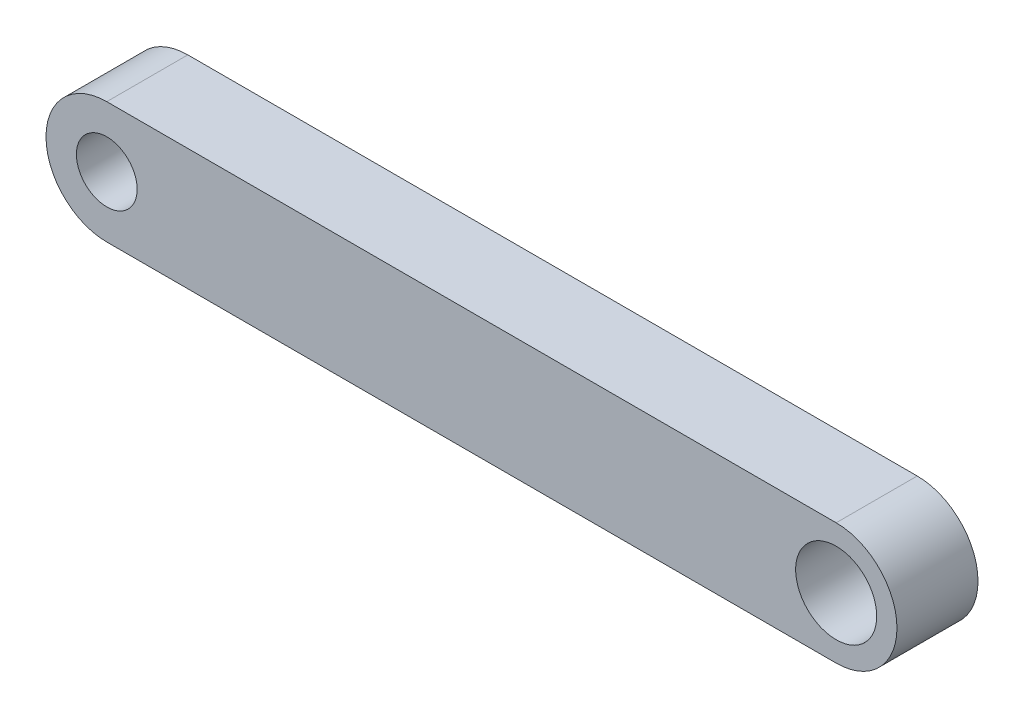
ISO-10303-21;
HEADER;
FILE_DESCRIPTION(('STEP AP214'),'2;1');
FILE_NAME('part.step','',(''),(''),'','','');
FILE_SCHEMA(('AUTOMOTIVE_DESIGN { 1 0 10303 214 1 1 1 1 }'));
ENDSEC;
DATA;
#1=APPLICATION_CONTEXT('core data for automotive mechanical design processes');
#2=APPLICATION_PROTOCOL_DEFINITION('international standard','automotive_design',2000,#1);
#3=PRODUCT_CONTEXT('',#1,'mechanical');
#4=PRODUCT('Part','Part','',(#3));
#5=PRODUCT_RELATED_PRODUCT_CATEGORY('part','',(#4));
#6=PRODUCT_DEFINITION_FORMATION('','',#4);
#7=PRODUCT_DEFINITION_CONTEXT('part definition',#1,'design');
#8=PRODUCT_DEFINITION('design','',#6,#7);
#9=PRODUCT_DEFINITION_SHAPE('','',#8);
#10=(LENGTH_UNIT() NAMED_UNIT(*) SI_UNIT(.MILLI.,.METRE.));
#11=(NAMED_UNIT(*) PLANE_ANGLE_UNIT() SI_UNIT($,.RADIAN.));
#12=(NAMED_UNIT(*) SI_UNIT($,.STERADIAN.) SOLID_ANGLE_UNIT());
#13=UNCERTAINTY_MEASURE_WITH_UNIT(LENGTH_MEASURE(1.E-05),#10,'distance_accuracy_value','');
#14=(GEOMETRIC_REPRESENTATION_CONTEXT(3) GLOBAL_UNCERTAINTY_ASSIGNED_CONTEXT((#13)) GLOBAL_UNIT_ASSIGNED_CONTEXT((#10,
#11,#12)) REPRESENTATION_CONTEXT('',''));
#15=CARTESIAN_POINT('',(0.,0.,0.));
#16=DIRECTION('',(0.,0.,1.));
#17=DIRECTION('',(1.,0.,0.));
#18=AXIS2_PLACEMENT_3D('',#15,#16,#17);
#19=CARTESIAN_POINT('',(-36.,0.,4.));
#20=DIRECTION('',(0.,0.,-1.));
#21=DIRECTION('',(-1.,0.,0.));
#22=AXIS2_PLACEMENT_3D('',#19,#20,#21);
#23=PLANE('',#22);
#24=CARTESIAN_POINT('',(-36.,0.,4.));
#25=DIRECTION('',(0.,0.,1.));
#26=DIRECTION('',(-1.,0.,0.));
#27=AXIS2_PLACEMENT_3D('',#24,#25,#26);
#28=CIRCLE('',#27,3.);
#29=CARTESIAN_POINT('',(-36.,3.,4.));
#30=VERTEX_POINT('',#29);
#31=CARTESIAN_POINT('',(-36.,-3.,4.));
#32=VERTEX_POINT('',#31);
#33=EDGE_CURVE('E95',#30,#32,#28,.T.);
#34=ORIENTED_EDGE('',*,*,#33,.T.);
#35=DIRECTION('',(1.,0.,0.));
#36=VECTOR('',#35,1.);
#37=CARTESIAN_POINT('',(0.,-3.,4.));
#38=LINE('',#37,#36);
#39=CARTESIAN_POINT('',(0.,-3.,4.));
#40=VERTEX_POINT('',#39);
#41=EDGE_CURVE('E90',#32,#40,#38,.T.);
#42=ORIENTED_EDGE('',*,*,#41,.T.);
#43=CARTESIAN_POINT('',(0.,0.,4.));
#44=DIRECTION('',(0.,0.,1.));
#45=DIRECTION('',(1.,0.,0.));
#46=AXIS2_PLACEMENT_3D('',#43,#44,#45);
#47=CIRCLE('',#46,3.);
#48=CARTESIAN_POINT('',(0.,3.,4.));
#49=VERTEX_POINT('',#48);
#50=EDGE_CURVE('E93',#40,#49,#47,.T.);
#51=ORIENTED_EDGE('',*,*,#50,.T.);
#52=DIRECTION('',(-1.,0.,0.));
#53=VECTOR('',#52,1.);
#54=CARTESIAN_POINT('',(0.,3.,4.));
#55=LINE('',#54,#53);
#56=EDGE_CURVE('E60',#49,#30,#55,.T.);
#57=ORIENTED_EDGE('',*,*,#56,.T.);
#58=EDGE_LOOP('',(#34,#42,#51,#57));
#59=FACE_BOUND('',#58,.T.);
#60=CARTESIAN_POINT('',(0.,0.,4.));
#61=DIRECTION('',(0.,0.,1.));
#62=DIRECTION('',(1.,0.,0.));
#63=AXIS2_PLACEMENT_3D('',#60,#61,#62);
#64=CIRCLE('',#63,2.);
#65=CARTESIAN_POINT('',(2.,0.,4.));
#66=VERTEX_POINT('',#65);
#67=EDGE_CURVE('E110',#66,#66,#64,.T.);
#68=ORIENTED_EDGE('',*,*,#67,.F.);
#69=EDGE_LOOP('',(#68));
#70=FACE_BOUND('',#69,.T.);
#71=CARTESIAN_POINT('',(-36.,0.,4.));
#72=DIRECTION('',(0.,0.,1.));
#73=DIRECTION('',(-1.,0.,0.));
#74=AXIS2_PLACEMENT_3D('',#71,#72,#73);
#75=CIRCLE('',#74,1.5);
#76=CARTESIAN_POINT('',(-37.5,0.,4.));
#77=VERTEX_POINT('',#76);
#78=EDGE_CURVE('E125',#77,#77,#75,.T.);
#79=ORIENTED_EDGE('',*,*,#78,.F.);
#80=EDGE_LOOP('',(#79));
#81=FACE_BOUND('',#80,.T.);
#82=ADVANCED_FACE('F43',(#59,#70,#81),#23,.F.);
#83=CARTESIAN_POINT('',(-36.,0.,0.));
#84=DIRECTION('',(0.,0.,-1.));
#85=DIRECTION('',(-1.,0.,0.));
#86=AXIS2_PLACEMENT_3D('',#83,#84,#85);
#87=PLANE('',#86);
#88=CARTESIAN_POINT('',(0.,0.,0.));
#89=DIRECTION('',(0.,0.,1.));
#90=DIRECTION('',(1.,0.,0.));
#91=AXIS2_PLACEMENT_3D('',#88,#89,#90);
#92=CIRCLE('',#91,2.);
#93=CARTESIAN_POINT('',(2.,0.,0.));
#94=VERTEX_POINT('',#93);
#95=EDGE_CURVE('E122',#94,#94,#92,.T.);
#96=ORIENTED_EDGE('',*,*,#95,.T.);
#97=EDGE_LOOP('',(#96));
#98=FACE_BOUND('',#97,.T.);
#99=CARTESIAN_POINT('',(-36.,0.,0.));
#100=DIRECTION('',(0.,0.,1.));
#101=DIRECTION('',(-1.,0.,0.));
#102=AXIS2_PLACEMENT_3D('',#99,#100,#101);
#103=CIRCLE('',#102,3.);
#104=CARTESIAN_POINT('',(-36.,3.,0.));
#105=VERTEX_POINT('',#104);
#106=CARTESIAN_POINT('',(-36.,-3.,0.));
#107=VERTEX_POINT('',#106);
#108=EDGE_CURVE('E107',#105,#107,#103,.T.);
#109=ORIENTED_EDGE('',*,*,#108,.F.);
#110=DIRECTION('',(-1.,0.,0.));
#111=VECTOR('',#110,1.);
#112=CARTESIAN_POINT('',(0.,3.,0.));
#113=LINE('',#112,#111);
#114=CARTESIAN_POINT('',(0.,3.,0.));
#115=VERTEX_POINT('',#114);
#116=EDGE_CURVE('E83',#115,#105,#113,.T.);
#117=ORIENTED_EDGE('',*,*,#116,.F.);
#118=CARTESIAN_POINT('',(0.,0.,0.));
#119=DIRECTION('',(0.,0.,1.));
#120=DIRECTION('',(1.,0.,0.));
#121=AXIS2_PLACEMENT_3D('',#118,#119,#120);
#122=CIRCLE('',#121,3.);
#123=CARTESIAN_POINT('',(0.,-3.,0.));
#124=VERTEX_POINT('',#123);
#125=EDGE_CURVE('E77',#124,#115,#122,.T.);
#126=ORIENTED_EDGE('',*,*,#125,.F.);
#127=DIRECTION('',(1.,0.,0.));
#128=VECTOR('',#127,1.);
#129=CARTESIAN_POINT('',(0.,-3.,0.));
#130=LINE('',#129,#128);
#131=EDGE_CURVE('E99',#107,#124,#130,.T.);
#132=ORIENTED_EDGE('',*,*,#131,.F.);
#133=EDGE_LOOP('',(#109,#117,#126,#132));
#134=FACE_BOUND('',#133,.T.);
#135=CARTESIAN_POINT('',(-36.,0.,0.));
#136=DIRECTION('',(0.,0.,1.));
#137=DIRECTION('',(-1.,0.,0.));
#138=AXIS2_PLACEMENT_3D('',#135,#136,#137);
#139=CIRCLE('',#138,1.5);
#140=CARTESIAN_POINT('',(-37.5,0.,0.));
#141=VERTEX_POINT('',#140);
#142=EDGE_CURVE('E128',#141,#141,#139,.T.);
#143=ORIENTED_EDGE('',*,*,#142,.T.);
#144=EDGE_LOOP('',(#143));
#145=FACE_BOUND('',#144,.T.);
#146=ADVANCED_FACE('F118',(#98,#134,#145),#87,.T.);
#147=CARTESIAN_POINT('',(-36.,0.,4.));
#148=DIRECTION('',(0.,0.,-1.));
#149=DIRECTION('',(-1.,0.,0.));
#150=AXIS2_PLACEMENT_3D('',#147,#148,#149);
#151=CYLINDRICAL_SURFACE('',#150,3.);
#152=ORIENTED_EDGE('',*,*,#108,.T.);
#153=DIRECTION('',(0.,0.,-1.));
#154=VECTOR('',#153,1.);
#155=CARTESIAN_POINT('',(-36.,-3.,4.));
#156=LINE('',#155,#154);
#157=EDGE_CURVE('E11',#32,#107,#156,.T.);
#158=ORIENTED_EDGE('',*,*,#157,.F.);
#159=ORIENTED_EDGE('',*,*,#33,.F.);
#160=DIRECTION('',(0.,0.,-1.));
#161=VECTOR('',#160,1.);
#162=CARTESIAN_POINT('',(-36.,3.,4.));
#163=LINE('',#162,#161);
#164=EDGE_CURVE('E103',#30,#105,#163,.T.);
#165=ORIENTED_EDGE('',*,*,#164,.T.);
#166=EDGE_LOOP('',(#152,#158,#159,#165));
#167=FACE_BOUND('',#166,.T.);
#168=ADVANCED_FACE('F45',(#167),#151,.T.);
#169=CARTESIAN_POINT('',(0.,-3.,4.));
#170=DIRECTION('',(0.,1.,0.));
#171=DIRECTION('',(0.,0.,1.));
#172=AXIS2_PLACEMENT_3D('',#169,#170,#171);
#173=PLANE('',#172);
#174=ORIENTED_EDGE('',*,*,#131,.T.);
#175=DIRECTION('',(0.,0.,-1.));
#176=VECTOR('',#175,1.);
#177=CARTESIAN_POINT('',(0.,-3.,4.));
#178=LINE('',#177,#176);
#179=EDGE_CURVE('E52',#40,#124,#178,.T.);
#180=ORIENTED_EDGE('',*,*,#179,.F.);
#181=ORIENTED_EDGE('',*,*,#41,.F.);
#182=ORIENTED_EDGE('',*,*,#157,.T.);
#183=EDGE_LOOP('',(#174,#180,#181,#182));
#184=FACE_BOUND('',#183,.T.);
#185=ADVANCED_FACE('F98',(#184),#173,.F.);
#186=CARTESIAN_POINT('',(0.,0.,4.));
#187=DIRECTION('',(0.,0.,-1.));
#188=DIRECTION('',(-1.,0.,0.));
#189=AXIS2_PLACEMENT_3D('',#186,#187,#188);
#190=CYLINDRICAL_SURFACE('',#189,3.);
#191=ORIENTED_EDGE('',*,*,#125,.T.);
#192=DIRECTION('',(0.,0.,-1.));
#193=VECTOR('',#192,1.);
#194=CARTESIAN_POINT('',(0.,3.,4.));
#195=LINE('',#194,#193);
#196=EDGE_CURVE('E100',#49,#115,#195,.T.);
#197=ORIENTED_EDGE('',*,*,#196,.F.);
#198=ORIENTED_EDGE('',*,*,#50,.F.);
#199=ORIENTED_EDGE('',*,*,#179,.T.);
#200=EDGE_LOOP('',(#191,#197,#198,#199));
#201=FACE_BOUND('',#200,.T.);
#202=ADVANCED_FACE('F101',(#201),#190,.T.);
#203=CARTESIAN_POINT('',(0.,3.,4.));
#204=DIRECTION('',(0.,-1.,0.));
#205=DIRECTION('',(1.,0.,0.));
#206=AXIS2_PLACEMENT_3D('',#203,#204,#205);
#207=PLANE('',#206);
#208=ORIENTED_EDGE('',*,*,#116,.T.);
#209=ORIENTED_EDGE('',*,*,#164,.F.);
#210=ORIENTED_EDGE('',*,*,#56,.F.);
#211=ORIENTED_EDGE('',*,*,#196,.T.);
#212=EDGE_LOOP('',(#208,#209,#210,#211));
#213=FACE_BOUND('',#212,.T.);
#214=ADVANCED_FACE('F115',(#213),#207,.F.);
#215=CARTESIAN_POINT('',(0.,0.,4.));
#216=DIRECTION('',(0.,0.,-1.));
#217=DIRECTION('',(-1.,0.,0.));
#218=AXIS2_PLACEMENT_3D('',#215,#216,#217);
#219=CYLINDRICAL_SURFACE('',#218,2.);
#220=ORIENTED_EDGE('',*,*,#67,.T.);
#221=EDGE_LOOP('',(#220));
#222=FACE_BOUND('',#221,.T.);
#223=ORIENTED_EDGE('',*,*,#95,.F.);
#224=EDGE_LOOP('',(#223));
#225=FACE_BOUND('',#224,.T.);
#226=ADVANCED_FACE('F145',(#222,#225),#219,.F.);
#227=CARTESIAN_POINT('',(-36.,0.,4.));
#228=DIRECTION('',(0.,0.,-1.));
#229=DIRECTION('',(-1.,0.,0.));
#230=AXIS2_PLACEMENT_3D('',#227,#228,#229);
#231=CYLINDRICAL_SURFACE('',#230,1.5);
#232=ORIENTED_EDGE('',*,*,#78,.T.);
#233=EDGE_LOOP('',(#232));
#234=FACE_BOUND('',#233,.T.);
#235=ORIENTED_EDGE('',*,*,#142,.F.);
#236=EDGE_LOOP('',(#235));
#237=FACE_BOUND('',#236,.T.);
#238=ADVANCED_FACE('F134',(#234,#237),#231,.F.);
#239=CLOSED_SHELL('',(#82,#146,#168,#185,#202,#214,#226,#238));
#240=MANIFOLD_SOLID_BREP('B2',#239);
#241=ADVANCED_BREP_SHAPE_REPRESENTATION('',(#18,#240),#14);
#242=SHAPE_DEFINITION_REPRESENTATION(#9,#241);
ENDSEC;
END-ISO-10303-21;
